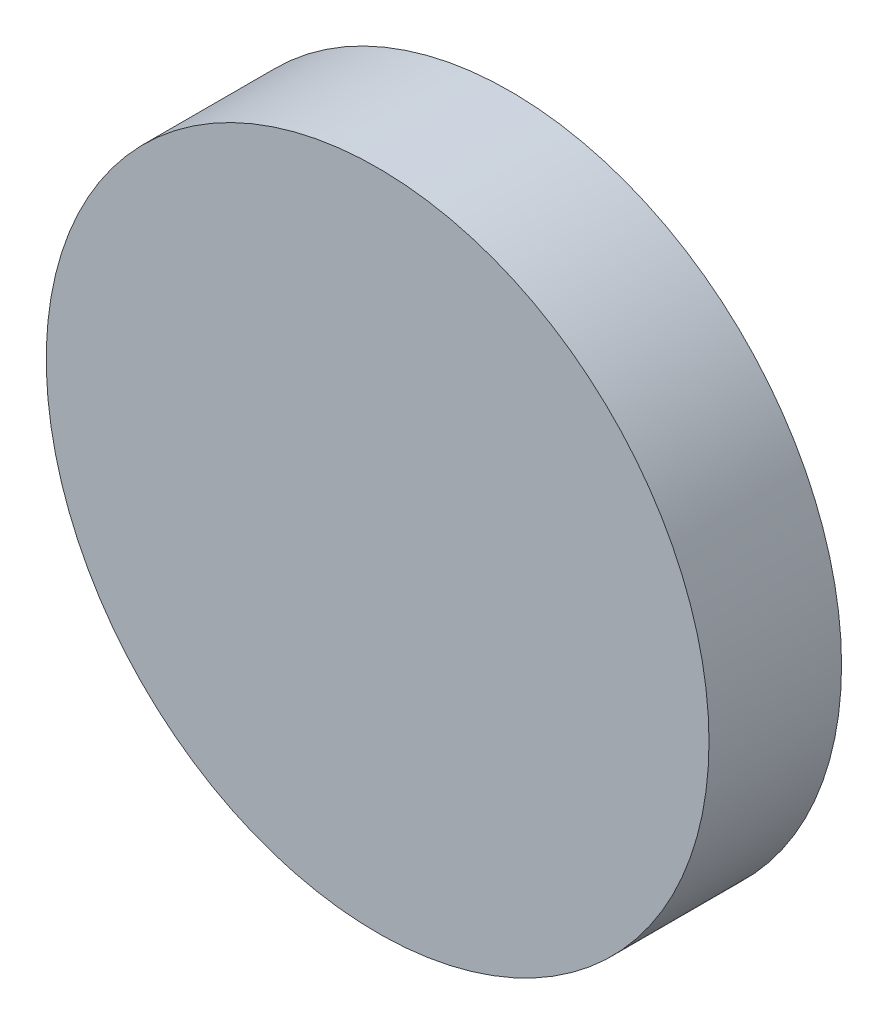
ISO-10303-21;
HEADER;
FILE_DESCRIPTION(('STEP AP214'),'2;1');
FILE_NAME('part.step','',(''),(''),'','','');
FILE_SCHEMA(('AUTOMOTIVE_DESIGN { 1 0 10303 214 1 1 1 1 }'));
ENDSEC;
DATA;
#1=APPLICATION_CONTEXT('core data for automotive mechanical design processes');
#2=APPLICATION_PROTOCOL_DEFINITION('international standard','automotive_design',2000,#1);
#3=PRODUCT_CONTEXT('',#1,'mechanical');
#4=PRODUCT('Part','Part','',(#3));
#5=PRODUCT_RELATED_PRODUCT_CATEGORY('part','',(#4));
#6=PRODUCT_DEFINITION_FORMATION('','',#4);
#7=PRODUCT_DEFINITION_CONTEXT('part definition',#1,'design');
#8=PRODUCT_DEFINITION('design','',#6,#7);
#9=PRODUCT_DEFINITION_SHAPE('','',#8);
#10=(LENGTH_UNIT() NAMED_UNIT(*) SI_UNIT(.MILLI.,.METRE.));
#11=(NAMED_UNIT(*) PLANE_ANGLE_UNIT() SI_UNIT($,.RADIAN.));
#12=(NAMED_UNIT(*) SI_UNIT($,.STERADIAN.) SOLID_ANGLE_UNIT());
#13=UNCERTAINTY_MEASURE_WITH_UNIT(LENGTH_MEASURE(1.E-05),#10,'distance_accuracy_value','');
#14=(GEOMETRIC_REPRESENTATION_CONTEXT(3) GLOBAL_UNCERTAINTY_ASSIGNED_CONTEXT((#13)) GLOBAL_UNIT_ASSIGNED_CONTEXT((#10,
#11,#12)) REPRESENTATION_CONTEXT('',''));
#15=CARTESIAN_POINT('',(0.,0.,0.));
#16=DIRECTION('',(0.,0.,1.));
#17=DIRECTION('',(1.,0.,0.));
#18=AXIS2_PLACEMENT_3D('',#15,#16,#17);
#19=CARTESIAN_POINT('',(0.,0.,2.54));
#20=DIRECTION('',(0.,0.,-1.));
#21=DIRECTION('',(-1.,0.,0.));
#22=AXIS2_PLACEMENT_3D('',#19,#20,#21);
#23=CYLINDRICAL_SURFACE('',#22,6.35);
#24=CARTESIAN_POINT('',(0.,0.,2.54));
#25=DIRECTION('',(0.,0.,1.));
#26=DIRECTION('',(1.,0.,0.));
#27=AXIS2_PLACEMENT_3D('',#24,#25,#26);
#28=CIRCLE('',#27,6.35);
#29=CARTESIAN_POINT('',(6.35,0.,2.54));
#30=VERTEX_POINT('',#29);
#31=EDGE_CURVE('E10',#30,#30,#28,.T.);
#32=ORIENTED_EDGE('',*,*,#31,.F.);
#33=EDGE_LOOP('',(#32));
#34=FACE_BOUND('',#33,.T.);
#35=CARTESIAN_POINT('',(0.,0.,0.));
#36=DIRECTION('',(0.,0.,1.));
#37=DIRECTION('',(1.,0.,0.));
#38=AXIS2_PLACEMENT_3D('',#35,#36,#37);
#39=CIRCLE('',#38,6.35);
#40=CARTESIAN_POINT('',(6.35,0.,0.));
#41=VERTEX_POINT('',#40);
#42=EDGE_CURVE('E34',#41,#41,#39,.T.);
#43=ORIENTED_EDGE('',*,*,#42,.T.);
#44=EDGE_LOOP('',(#43));
#45=FACE_BOUND('',#44,.T.);
#46=ADVANCED_FACE('F31',(#34,#45),#23,.T.);
#47=CARTESIAN_POINT('',(0.,0.,2.54));
#48=DIRECTION('',(0.,0.,1.));
#49=DIRECTION('',(1.,0.,0.));
#50=AXIS2_PLACEMENT_3D('',#47,#48,#49);
#51=PLANE('',#50);
#52=ORIENTED_EDGE('',*,*,#31,.T.);
#53=EDGE_LOOP('',(#52));
#54=FACE_BOUND('',#53,.T.);
#55=ADVANCED_FACE('F46',(#54),#51,.T.);
#56=CARTESIAN_POINT('',(0.,0.,0.));
#57=DIRECTION('',(0.,0.,1.));
#58=DIRECTION('',(1.,0.,0.));
#59=AXIS2_PLACEMENT_3D('',#56,#57,#58);
#60=PLANE('',#59);
#61=ORIENTED_EDGE('',*,*,#42,.F.);
#62=EDGE_LOOP('',(#61));
#63=FACE_BOUND('',#62,.T.);
#64=ADVANCED_FACE('F44',(#63),#60,.F.);
#65=CLOSED_SHELL('',(#46,#55,#64));
#66=MANIFOLD_SOLID_BREP('B2',#65);
#67=ADVANCED_BREP_SHAPE_REPRESENTATION('',(#18,#66),#14);
#68=SHAPE_DEFINITION_REPRESENTATION(#9,#67);
ENDSEC;
END-ISO-10303-21;
